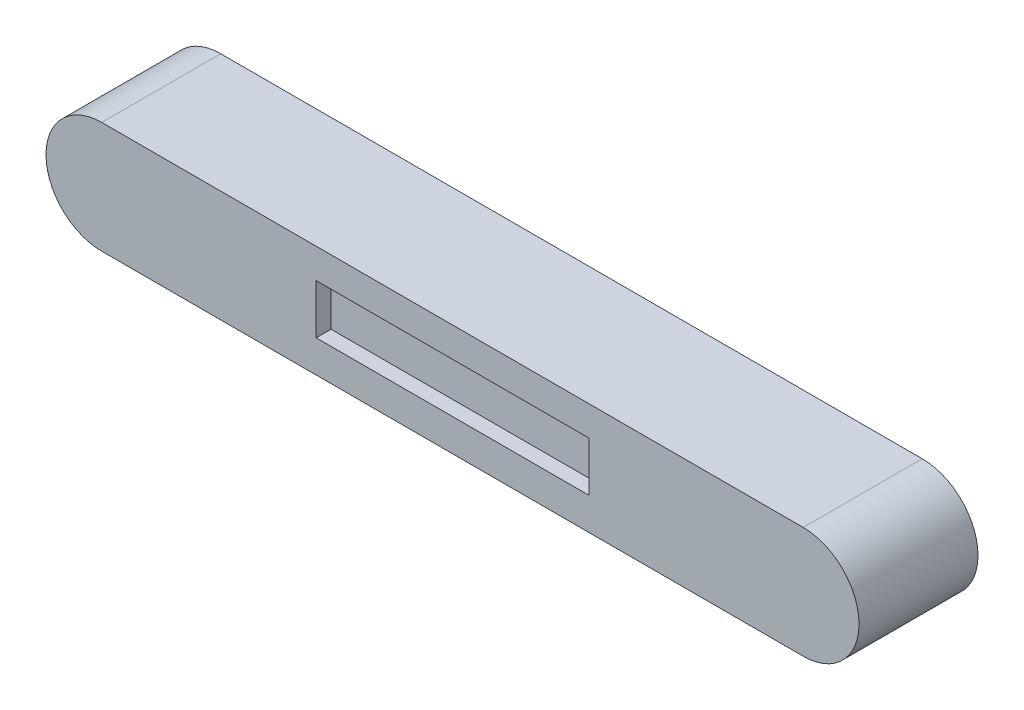
ISO-10303-21;
HEADER;
FILE_DESCRIPTION(('STEP AP214'),'2;1');
FILE_NAME('part.step','',(''),(''),'','','');
FILE_SCHEMA(('AUTOMOTIVE_DESIGN { 1 0 10303 214 1 1 1 1 }'));
ENDSEC;
DATA;
#1=APPLICATION_CONTEXT('core data for automotive mechanical design processes');
#2=APPLICATION_PROTOCOL_DEFINITION('international standard','automotive_design',2000,#1);
#3=PRODUCT_CONTEXT('',#1,'mechanical');
#4=PRODUCT('Part','Part','',(#3));
#5=PRODUCT_RELATED_PRODUCT_CATEGORY('part','',(#4));
#6=PRODUCT_DEFINITION_FORMATION('','',#4);
#7=PRODUCT_DEFINITION_CONTEXT('part definition',#1,'design');
#8=PRODUCT_DEFINITION('design','',#6,#7);
#9=PRODUCT_DEFINITION_SHAPE('','',#8);
#10=(LENGTH_UNIT() NAMED_UNIT(*) SI_UNIT(.MILLI.,.METRE.));
#11=(NAMED_UNIT(*) PLANE_ANGLE_UNIT() SI_UNIT($,.RADIAN.));
#12=(NAMED_UNIT(*) SI_UNIT($,.STERADIAN.) SOLID_ANGLE_UNIT());
#13=UNCERTAINTY_MEASURE_WITH_UNIT(LENGTH_MEASURE(1.E-05),#10,'distance_accuracy_value','');
#14=(GEOMETRIC_REPRESENTATION_CONTEXT(3) GLOBAL_UNCERTAINTY_ASSIGNED_CONTEXT((#13)) GLOBAL_UNIT_ASSIGNED_CONTEXT((#10,
#11,#12)) REPRESENTATION_CONTEXT('',''));
#15=CARTESIAN_POINT('',(0.,0.,0.));
#16=DIRECTION('',(0.,0.,1.));
#17=DIRECTION('',(1.,0.,0.));
#18=AXIS2_PLACEMENT_3D('',#15,#16,#17);
#19=CARTESIAN_POINT('',(0.,22.5,24.));
#20=DIRECTION('',(0.,-1.,0.));
#21=DIRECTION('',(0.,0.,-1.));
#22=AXIS2_PLACEMENT_3D('',#19,#20,#21);
#23=PLANE('',#22);
#24=DIRECTION('',(0.,0.,1.));
#25=VECTOR('',#24,1.);
#26=CARTESIAN_POINT('',(11.25,22.5,0.));
#27=LINE('',#26,#25);
#28=CARTESIAN_POINT('',(11.25,22.5,0.));
#29=VERTEX_POINT('',#28);
#30=CARTESIAN_POINT('',(11.25,22.5,24.));
#31=VERTEX_POINT('',#30);
#32=EDGE_CURVE('E176',#29,#31,#27,.T.);
#33=ORIENTED_EDGE('',*,*,#32,.T.);
#34=DIRECTION('',(-1.,0.,0.));
#35=VECTOR('',#34,1.);
#36=CARTESIAN_POINT('',(0.,22.5,24.));
#37=LINE('',#36,#35);
#38=CARTESIAN_POINT('',(152.75,22.5,24.));
#39=VERTEX_POINT('',#38);
#40=EDGE_CURVE('E12',#39,#31,#37,.T.);
#41=ORIENTED_EDGE('',*,*,#40,.F.);
#42=DIRECTION('',(0.,0.,1.));
#43=VECTOR('',#42,1.);
#44=CARTESIAN_POINT('',(152.75,22.5,0.));
#45=LINE('',#44,#43);
#46=CARTESIAN_POINT('',(152.75,22.5,0.));
#47=VERTEX_POINT('',#46);
#48=EDGE_CURVE('E94',#47,#39,#45,.T.);
#49=ORIENTED_EDGE('',*,*,#48,.F.);
#50=DIRECTION('',(-1.,0.,0.));
#51=VECTOR('',#50,1.);
#52=CARTESIAN_POINT('',(0.,22.5,0.));
#53=LINE('',#52,#51);
#54=EDGE_CURVE('E57',#47,#29,#53,.T.);
#55=ORIENTED_EDGE('',*,*,#54,.T.);
#56=EDGE_LOOP('',(#33,#41,#49,#55));
#57=FACE_BOUND('',#56,.T.);
#58=ADVANCED_FACE('F53',(#57),#23,.F.);
#59=CARTESIAN_POINT('',(0.,0.,24.));
#60=DIRECTION('',(0.,0.,-1.));
#61=DIRECTION('',(-1.,0.,0.));
#62=AXIS2_PLACEMENT_3D('',#59,#60,#61);
#63=PLANE('',#62);
#64=DIRECTION('',(-1.,0.,0.));
#65=VECTOR('',#64,1.);
#66=CARTESIAN_POINT('',(54.5,16.5,24.));
#67=LINE('',#66,#65);
#68=CARTESIAN_POINT('',(109.5,16.5,24.));
#69=VERTEX_POINT('',#68);
#70=CARTESIAN_POINT('',(54.5,16.5,24.));
#71=VERTEX_POINT('',#70);
#72=EDGE_CURVE('E149',#69,#71,#67,.T.);
#73=ORIENTED_EDGE('',*,*,#72,.F.);
#74=DIRECTION('',(0.,1.,0.));
#75=VECTOR('',#74,1.);
#76=CARTESIAN_POINT('',(109.5,6.5,24.));
#77=LINE('',#76,#75);
#78=CARTESIAN_POINT('',(109.5,6.5,24.));
#79=VERTEX_POINT('',#78);
#80=EDGE_CURVE('E70',#79,#69,#77,.T.);
#81=ORIENTED_EDGE('',*,*,#80,.F.);
#82=DIRECTION('',(1.,0.,0.));
#83=VECTOR('',#82,1.);
#84=CARTESIAN_POINT('',(54.5,6.5,24.));
#85=LINE('',#84,#83);
#86=CARTESIAN_POINT('',(54.5,6.5,24.));
#87=VERTEX_POINT('',#86);
#88=EDGE_CURVE('E163',#87,#79,#85,.T.);
#89=ORIENTED_EDGE('',*,*,#88,.F.);
#90=DIRECTION('',(0.,-1.,0.));
#91=VECTOR('',#90,1.);
#92=CARTESIAN_POINT('',(54.5,6.5,24.));
#93=LINE('',#92,#91);
#94=EDGE_CURVE('E169',#71,#87,#93,.T.);
#95=ORIENTED_EDGE('',*,*,#94,.F.);
#96=EDGE_LOOP('',(#73,#81,#89,#95));
#97=FACE_BOUND('',#96,.T.);
#98=ORIENTED_EDGE('',*,*,#40,.T.);
#99=CARTESIAN_POINT('',(11.25,11.25,24.));
#100=DIRECTION('',(0.,0.,1.));
#101=DIRECTION('',(1.,0.,0.));
#102=AXIS2_PLACEMENT_3D('',#99,#100,#101);
#103=CIRCLE('',#102,11.25);
#104=CARTESIAN_POINT('',(11.25,0.,24.));
#105=VERTEX_POINT('',#104);
#106=EDGE_CURVE('E100',#105,#31,#103,.F.);
#107=ORIENTED_EDGE('',*,*,#106,.F.);
#108=DIRECTION('',(1.,0.,0.));
#109=VECTOR('',#108,1.);
#110=CARTESIAN_POINT('',(0.,0.,24.));
#111=LINE('',#110,#109);
#112=CARTESIAN_POINT('',(152.75,0.,24.));
#113=VERTEX_POINT('',#112);
#114=EDGE_CURVE('E62',#105,#113,#111,.T.);
#115=ORIENTED_EDGE('',*,*,#114,.T.);
#116=CARTESIAN_POINT('',(152.75,11.25,24.));
#117=DIRECTION('',(0.,0.,1.));
#118=DIRECTION('',(1.,0.,0.));
#119=AXIS2_PLACEMENT_3D('',#116,#117,#118);
#120=CIRCLE('',#119,11.25);
#121=EDGE_CURVE('E108',#113,#39,#120,.T.);
#122=ORIENTED_EDGE('',*,*,#121,.T.);
#123=EDGE_LOOP('',(#98,#107,#115,#122));
#124=FACE_BOUND('',#123,.T.);
#125=ADVANCED_FACE('F207',(#97,#124),#63,.F.);
#126=CARTESIAN_POINT('',(0.,0.,0.));
#127=DIRECTION('',(0.,0.,-1.));
#128=DIRECTION('',(-1.,0.,0.));
#129=AXIS2_PLACEMENT_3D('',#126,#127,#128);
#130=PLANE('',#129);
#131=CARTESIAN_POINT('',(11.25,11.25,0.));
#132=DIRECTION('',(0.,0.,1.));
#133=DIRECTION('',(1.,0.,0.));
#134=AXIS2_PLACEMENT_3D('',#131,#132,#133);
#135=CIRCLE('',#134,11.25);
#136=CARTESIAN_POINT('',(11.25,0.,0.));
#137=VERTEX_POINT('',#136);
#138=EDGE_CURVE('E79',#137,#29,#135,.F.);
#139=ORIENTED_EDGE('',*,*,#138,.T.);
#140=ORIENTED_EDGE('',*,*,#54,.F.);
#141=CARTESIAN_POINT('',(152.75,11.25,0.));
#142=DIRECTION('',(0.,0.,1.));
#143=DIRECTION('',(1.,0.,0.));
#144=AXIS2_PLACEMENT_3D('',#141,#142,#143);
#145=CIRCLE('',#144,11.25);
#146=CARTESIAN_POINT('',(152.75,0.,0.));
#147=VERTEX_POINT('',#146);
#148=EDGE_CURVE('E115',#147,#47,#145,.T.);
#149=ORIENTED_EDGE('',*,*,#148,.F.);
#150=DIRECTION('',(1.,0.,0.));
#151=VECTOR('',#150,1.);
#152=CARTESIAN_POINT('',(0.,0.,0.));
#153=LINE('',#152,#151);
#154=EDGE_CURVE('E183',#137,#147,#153,.T.);
#155=ORIENTED_EDGE('',*,*,#154,.F.);
#156=EDGE_LOOP('',(#139,#140,#149,#155));
#157=FACE_BOUND('',#156,.T.);
#158=ADVANCED_FACE('F193',(#157),#130,.T.);
#159=CARTESIAN_POINT('',(0.,0.,24.));
#160=DIRECTION('',(0.,1.,0.));
#161=DIRECTION('',(0.,0.,1.));
#162=AXIS2_PLACEMENT_3D('',#159,#160,#161);
#163=PLANE('',#162);
#164=ORIENTED_EDGE('',*,*,#154,.T.);
#165=DIRECTION('',(0.,0.,1.));
#166=VECTOR('',#165,1.);
#167=CARTESIAN_POINT('',(152.75,0.,0.));
#168=LINE('',#167,#166);
#169=EDGE_CURVE('E173',#147,#113,#168,.T.);
#170=ORIENTED_EDGE('',*,*,#169,.T.);
#171=ORIENTED_EDGE('',*,*,#114,.F.);
#172=DIRECTION('',(0.,0.,1.));
#173=VECTOR('',#172,1.);
#174=CARTESIAN_POINT('',(11.25,0.,0.));
#175=LINE('',#174,#173);
#176=EDGE_CURVE('E180',#137,#105,#175,.T.);
#177=ORIENTED_EDGE('',*,*,#176,.F.);
#178=EDGE_LOOP('',(#164,#170,#171,#177));
#179=FACE_BOUND('',#178,.T.);
#180=ADVANCED_FACE('F55',(#179),#163,.F.);
#181=CARTESIAN_POINT('',(152.75,11.25,0.));
#182=DIRECTION('',(0.,0.,1.));
#183=DIRECTION('',(1.,0.,0.));
#184=AXIS2_PLACEMENT_3D('',#181,#182,#183);
#185=CYLINDRICAL_SURFACE('',#184,11.25);
#186=ORIENTED_EDGE('',*,*,#121,.F.);
#187=ORIENTED_EDGE('',*,*,#169,.F.);
#188=ORIENTED_EDGE('',*,*,#148,.T.);
#189=ORIENTED_EDGE('',*,*,#48,.T.);
#190=EDGE_LOOP('',(#186,#187,#188,#189));
#191=FACE_BOUND('',#190,.T.);
#192=ADVANCED_FACE('F197',(#191),#185,.T.);
#193=CARTESIAN_POINT('',(11.25,11.25,0.));
#194=DIRECTION('',(0.,0.,1.));
#195=DIRECTION('',(1.,0.,0.));
#196=AXIS2_PLACEMENT_3D('',#193,#194,#195);
#197=CYLINDRICAL_SURFACE('',#196,11.25);
#198=ORIENTED_EDGE('',*,*,#106,.T.);
#199=ORIENTED_EDGE('',*,*,#32,.F.);
#200=ORIENTED_EDGE('',*,*,#138,.F.);
#201=ORIENTED_EDGE('',*,*,#176,.T.);
#202=EDGE_LOOP('',(#198,#199,#200,#201));
#203=FACE_BOUND('',#202,.T.);
#204=ADVANCED_FACE('F194',(#203),#197,.T.);
#205=CARTESIAN_POINT('',(109.5,6.5,21.));
#206=DIRECTION('',(1.,0.,0.));
#207=DIRECTION('',(0.,0.,-1.));
#208=AXIS2_PLACEMENT_3D('',#205,#206,#207);
#209=PLANE('',#208);
#210=ORIENTED_EDGE('',*,*,#80,.T.);
#211=DIRECTION('',(0.,0.,1.));
#212=VECTOR('',#211,1.);
#213=CARTESIAN_POINT('',(109.5,16.5,21.));
#214=LINE('',#213,#212);
#215=CARTESIAN_POINT('',(109.5,16.5,21.));
#216=VERTEX_POINT('',#215);
#217=EDGE_CURVE('E137',#216,#69,#214,.T.);
#218=ORIENTED_EDGE('',*,*,#217,.F.);
#219=DIRECTION('',(0.,1.,0.));
#220=VECTOR('',#219,1.);
#221=CARTESIAN_POINT('',(109.5,6.5,21.));
#222=LINE('',#221,#220);
#223=CARTESIAN_POINT('',(109.5,6.5,21.));
#224=VERTEX_POINT('',#223);
#225=EDGE_CURVE('E161',#224,#216,#222,.T.);
#226=ORIENTED_EDGE('',*,*,#225,.F.);
#227=DIRECTION('',(0.,0.,1.));
#228=VECTOR('',#227,1.);
#229=CARTESIAN_POINT('',(109.5,6.5,21.));
#230=LINE('',#229,#228);
#231=EDGE_CURVE('E122',#224,#79,#230,.T.);
#232=ORIENTED_EDGE('',*,*,#231,.T.);
#233=EDGE_LOOP('',(#210,#218,#226,#232));
#234=FACE_BOUND('',#233,.T.);
#235=ADVANCED_FACE('F196',(#234),#209,.F.);
#236=CARTESIAN_POINT('',(54.5,6.5,21.));
#237=DIRECTION('',(0.,-1.,0.));
#238=DIRECTION('',(0.,0.,-1.));
#239=AXIS2_PLACEMENT_3D('',#236,#237,#238);
#240=PLANE('',#239);
#241=ORIENTED_EDGE('',*,*,#88,.T.);
#242=ORIENTED_EDGE('',*,*,#231,.F.);
#243=DIRECTION('',(1.,0.,0.));
#244=VECTOR('',#243,1.);
#245=CARTESIAN_POINT('',(54.5,6.5,21.));
#246=LINE('',#245,#244);
#247=CARTESIAN_POINT('',(54.5,6.5,21.));
#248=VERTEX_POINT('',#247);
#249=EDGE_CURVE('E158',#248,#224,#246,.T.);
#250=ORIENTED_EDGE('',*,*,#249,.F.);
#251=DIRECTION('',(0.,0.,1.));
#252=VECTOR('',#251,1.);
#253=CARTESIAN_POINT('',(54.5,6.5,21.));
#254=LINE('',#253,#252);
#255=EDGE_CURVE('E133',#248,#87,#254,.T.);
#256=ORIENTED_EDGE('',*,*,#255,.T.);
#257=EDGE_LOOP('',(#241,#242,#250,#256));
#258=FACE_BOUND('',#257,.T.);
#259=ADVANCED_FACE('F203',(#258),#240,.F.);
#260=CARTESIAN_POINT('',(54.5,6.5,21.));
#261=DIRECTION('',(-1.,0.,0.));
#262=DIRECTION('',(0.,0.,1.));
#263=AXIS2_PLACEMENT_3D('',#260,#261,#262);
#264=PLANE('',#263);
#265=ORIENTED_EDGE('',*,*,#94,.T.);
#266=ORIENTED_EDGE('',*,*,#255,.F.);
#267=DIRECTION('',(0.,-1.,0.));
#268=VECTOR('',#267,1.);
#269=CARTESIAN_POINT('',(54.5,6.5,21.));
#270=LINE('',#269,#268);
#271=CARTESIAN_POINT('',(54.5,16.5,21.));
#272=VERTEX_POINT('',#271);
#273=EDGE_CURVE('E154',#272,#248,#270,.T.);
#274=ORIENTED_EDGE('',*,*,#273,.F.);
#275=DIRECTION('',(0.,0.,1.));
#276=VECTOR('',#275,1.);
#277=CARTESIAN_POINT('',(54.5,16.5,21.));
#278=LINE('',#277,#276);
#279=EDGE_CURVE('E142',#272,#71,#278,.T.);
#280=ORIENTED_EDGE('',*,*,#279,.T.);
#281=EDGE_LOOP('',(#265,#266,#274,#280));
#282=FACE_BOUND('',#281,.T.);
#283=ADVANCED_FACE('F155',(#282),#264,.F.);
#284=CARTESIAN_POINT('',(54.5,16.5,21.));
#285=DIRECTION('',(0.,1.,0.));
#286=DIRECTION('',(0.,0.,1.));
#287=AXIS2_PLACEMENT_3D('',#284,#285,#286);
#288=PLANE('',#287);
#289=ORIENTED_EDGE('',*,*,#72,.T.);
#290=ORIENTED_EDGE('',*,*,#279,.F.);
#291=DIRECTION('',(-1.,0.,0.));
#292=VECTOR('',#291,1.);
#293=CARTESIAN_POINT('',(54.5,16.5,21.));
#294=LINE('',#293,#292);
#295=EDGE_CURVE('E146',#216,#272,#294,.T.);
#296=ORIENTED_EDGE('',*,*,#295,.F.);
#297=ORIENTED_EDGE('',*,*,#217,.T.);
#298=EDGE_LOOP('',(#289,#290,#296,#297));
#299=FACE_BOUND('',#298,.T.);
#300=ADVANCED_FACE('F144',(#299),#288,.F.);
#301=CARTESIAN_POINT('',(0.,0.,21.));
#302=DIRECTION('',(0.,0.,-1.));
#303=DIRECTION('',(-1.,0.,0.));
#304=AXIS2_PLACEMENT_3D('',#301,#302,#303);
#305=PLANE('',#304);
#306=ORIENTED_EDGE('',*,*,#225,.T.);
#307=ORIENTED_EDGE('',*,*,#295,.T.);
#308=ORIENTED_EDGE('',*,*,#273,.T.);
#309=ORIENTED_EDGE('',*,*,#249,.T.);
#310=EDGE_LOOP('',(#306,#307,#308,#309));
#311=FACE_BOUND('',#310,.T.);
#312=ADVANCED_FACE('F160',(#311),#305,.F.);
#313=CLOSED_SHELL('',(#58,#125,#158,#180,#192,#204,#235,#259,#283,#300,#312));
#314=MANIFOLD_SOLID_BREP('B2',#313);
#315=ADVANCED_BREP_SHAPE_REPRESENTATION('',(#18,#314),#14);
#316=SHAPE_DEFINITION_REPRESENTATION(#9,#315);
ENDSEC;
END-ISO-10303-21;
